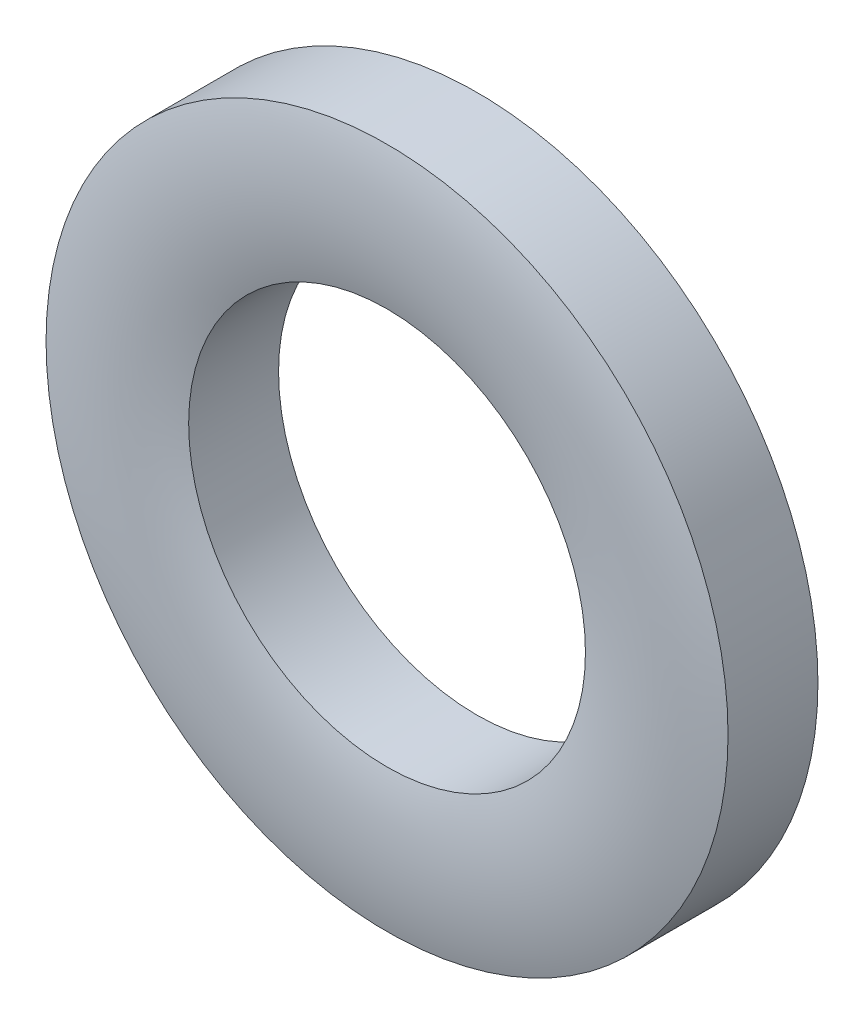
ISO-10303-21;
HEADER;
FILE_DESCRIPTION(('STEP AP214'),'2;1');
FILE_NAME('part.step','',(''),(''),'','','');
FILE_SCHEMA(('AUTOMOTIVE_DESIGN { 1 0 10303 214 1 1 1 1 }'));
ENDSEC;
DATA;
#1=APPLICATION_CONTEXT('core data for automotive mechanical design processes');
#2=APPLICATION_PROTOCOL_DEFINITION('international standard','automotive_design',2000,#1);
#3=PRODUCT_CONTEXT('',#1,'mechanical');
#4=PRODUCT('Part','Part','',(#3));
#5=PRODUCT_RELATED_PRODUCT_CATEGORY('part','',(#4));
#6=PRODUCT_DEFINITION_FORMATION('','',#4);
#7=PRODUCT_DEFINITION_CONTEXT('part definition',#1,'design');
#8=PRODUCT_DEFINITION('design','',#6,#7);
#9=PRODUCT_DEFINITION_SHAPE('','',#8);
#10=(LENGTH_UNIT() NAMED_UNIT(*) SI_UNIT(.MILLI.,.METRE.));
#11=(NAMED_UNIT(*) PLANE_ANGLE_UNIT() SI_UNIT($,.RADIAN.));
#12=(NAMED_UNIT(*) SI_UNIT($,.STERADIAN.) SOLID_ANGLE_UNIT());
#13=UNCERTAINTY_MEASURE_WITH_UNIT(LENGTH_MEASURE(1.E-05),#10,'distance_accuracy_value','');
#14=(GEOMETRIC_REPRESENTATION_CONTEXT(3) GLOBAL_UNCERTAINTY_ASSIGNED_CONTEXT((#13)) GLOBAL_UNIT_ASSIGNED_CONTEXT((#10,
#11,#12)) REPRESENTATION_CONTEXT('',''));
#15=CARTESIAN_POINT('',(0.,0.,0.));
#16=DIRECTION('',(0.,0.,1.));
#17=DIRECTION('',(1.,0.,0.));
#18=AXIS2_PLACEMENT_3D('',#15,#16,#17);
#19=CARTESIAN_POINT('',(0.,3.2,-0.8));
#20=DIRECTION('',(0.,0.,1.));
#21=DIRECTION('',(1.,0.,0.));
#22=AXIS2_PLACEMENT_3D('',#19,#20,#21);
#23=PLANE('',#22);
#24=CARTESIAN_POINT('',(0.,0.,-0.8));
#25=DIRECTION('',(0.,0.,1.));
#26=DIRECTION('',(1.,0.,0.));
#27=AXIS2_PLACEMENT_3D('',#24,#25,#26);
#28=CIRCLE('',#27,5.5);
#29=CARTESIAN_POINT('',(5.5,0.,-0.8));
#30=VERTEX_POINT('',#29);
#31=EDGE_CURVE('E51',#30,#30,#28,.T.);
#32=ORIENTED_EDGE('',*,*,#31,.F.);
#33=EDGE_LOOP('',(#32));
#34=FACE_BOUND('',#33,.T.);
#35=CARTESIAN_POINT('',(0.,0.,-0.8));
#36=DIRECTION('',(0.,0.,1.));
#37=DIRECTION('',(1.,0.,0.));
#38=AXIS2_PLACEMENT_3D('',#35,#36,#37);
#39=CIRCLE('',#38,3.2);
#40=CARTESIAN_POINT('',(3.2,0.,-0.8));
#41=VERTEX_POINT('',#40);
#42=EDGE_CURVE('E10',#41,#41,#39,.T.);
#43=ORIENTED_EDGE('',*,*,#42,.T.);
#44=EDGE_LOOP('',(#43));
#45=FACE_BOUND('',#44,.T.);
#46=ADVANCED_FACE('F37',(#34,#45),#23,.F.);
#47=CARTESIAN_POINT('',(0.,0.,0.8));
#48=DIRECTION('',(0.,0.,1.));
#49=DIRECTION('',(1.,0.,0.));
#50=AXIS2_PLACEMENT_3D('',#47,#48,#49);
#51=CYLINDRICAL_SURFACE('',#50,3.2);
#52=ORIENTED_EDGE('',*,*,#42,.F.);
#53=EDGE_LOOP('',(#52));
#54=FACE_BOUND('',#53,.T.);
#55=CARTESIAN_POINT('',(0.,0.,0.65008));
#56=DIRECTION('',(0.,0.,1.));
#57=DIRECTION('',(1.,0.,0.));
#58=AXIS2_PLACEMENT_3D('',#55,#56,#57);
#59=CIRCLE('',#58,3.2);
#60=CARTESIAN_POINT('',(3.2,0.,0.65008));
#61=VERTEX_POINT('',#60);
#62=EDGE_CURVE('E43',#61,#61,#59,.T.);
#63=ORIENTED_EDGE('',*,*,#62,.T.);
#64=EDGE_LOOP('',(#63));
#65=FACE_BOUND('',#64,.T.);
#66=ADVANCED_FACE('F60',(#54,#65),#51,.F.);
#67=CARTESIAN_POINT('',(0.,0.,-3.68564569903949));
#68=DIRECTION('',(0.,0.,1.));
#69=DIRECTION('',(1.,0.,0.));
#70=AXIS2_PLACEMENT_3D('',#67,#68,#69);
#71=DEGENERATE_TOROIDAL_SURFACE('',#70,4.35,4.48564569903949,.T.);
#72=ORIENTED_EDGE('',*,*,#62,.F.);
#73=EDGE_LOOP('',(#72));
#74=FACE_BOUND('',#73,.T.);
#75=CARTESIAN_POINT('',(0.,0.,0.65008));
#76=DIRECTION('',(0.,0.,1.));
#77=DIRECTION('',(1.,0.,0.));
#78=AXIS2_PLACEMENT_3D('',#75,#76,#77);
#79=CIRCLE('',#78,5.5);
#80=CARTESIAN_POINT('',(5.5,0.,0.65008));
#81=VERTEX_POINT('',#80);
#82=EDGE_CURVE('E47',#81,#81,#79,.T.);
#83=ORIENTED_EDGE('',*,*,#82,.T.);
#84=EDGE_LOOP('',(#83));
#85=FACE_BOUND('',#84,.T.);
#86=ADVANCED_FACE('F64',(#74,#85),#71,.T.);
#87=CARTESIAN_POINT('',(0.,0.,0.8));
#88=DIRECTION('',(0.,0.,1.));
#89=DIRECTION('',(1.,0.,0.));
#90=AXIS2_PLACEMENT_3D('',#87,#88,#89);
#91=CYLINDRICAL_SURFACE('',#90,5.5);
#92=ORIENTED_EDGE('',*,*,#82,.F.);
#93=EDGE_LOOP('',(#92));
#94=FACE_BOUND('',#93,.T.);
#95=ORIENTED_EDGE('',*,*,#31,.T.);
#96=EDGE_LOOP('',(#95));
#97=FACE_BOUND('',#96,.T.);
#98=ADVANCED_FACE('F57',(#94,#97),#91,.T.);
#99=CLOSED_SHELL('',(#46,#66,#86,#98));
#100=MANIFOLD_SOLID_BREP('B2',#99);
#101=ADVANCED_BREP_SHAPE_REPRESENTATION('',(#18,#100),#14);
#102=SHAPE_DEFINITION_REPRESENTATION(#9,#101);
ENDSEC;
END-ISO-10303-21;
